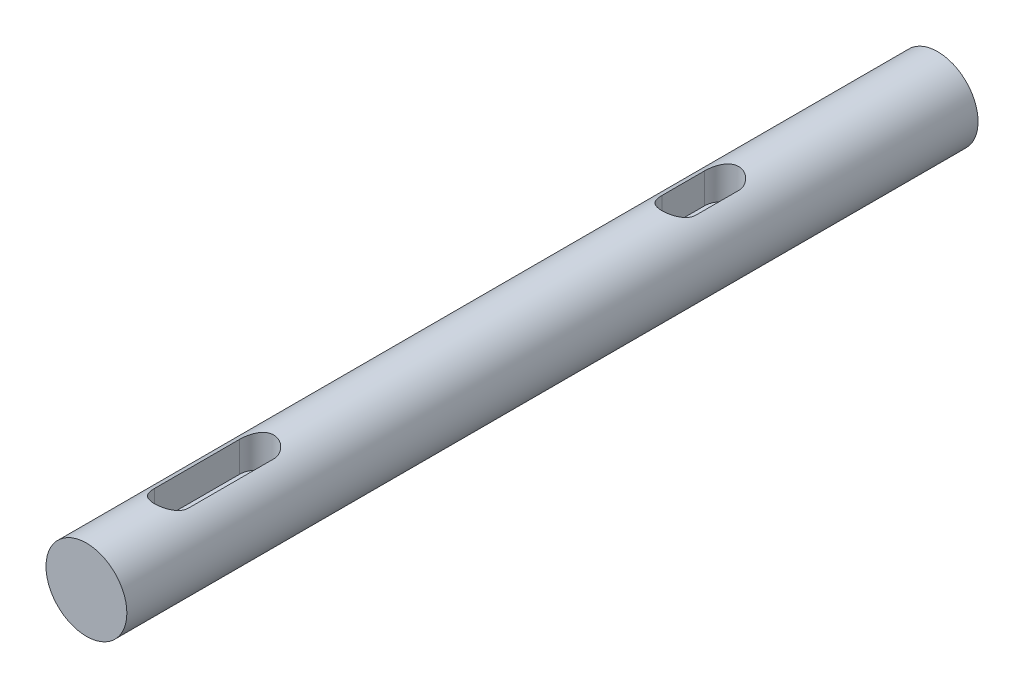
ISO-10303-21;
HEADER;
FILE_DESCRIPTION(('STEP AP214'),'2;1');
FILE_NAME('part.step','',(''),(''),'','','');
FILE_SCHEMA(('AUTOMOTIVE_DESIGN { 1 0 10303 214 1 1 1 1 }'));
ENDSEC;
DATA;
#1=APPLICATION_CONTEXT('core data for automotive mechanical design processes');
#2=APPLICATION_PROTOCOL_DEFINITION('international standard','automotive_design',2000,#1);
#3=PRODUCT_CONTEXT('',#1,'mechanical');
#4=PRODUCT('Part','Part','',(#3));
#5=PRODUCT_RELATED_PRODUCT_CATEGORY('part','',(#4));
#6=PRODUCT_DEFINITION_FORMATION('','',#4);
#7=PRODUCT_DEFINITION_CONTEXT('part definition',#1,'design');
#8=PRODUCT_DEFINITION('design','',#6,#7);
#9=PRODUCT_DEFINITION_SHAPE('','',#8);
#10=(LENGTH_UNIT() NAMED_UNIT(*) SI_UNIT(.MILLI.,.METRE.));
#11=(NAMED_UNIT(*) PLANE_ANGLE_UNIT() SI_UNIT($,.RADIAN.));
#12=(NAMED_UNIT(*) SI_UNIT($,.STERADIAN.) SOLID_ANGLE_UNIT());
#13=UNCERTAINTY_MEASURE_WITH_UNIT(LENGTH_MEASURE(1.E-05),#10,'distance_accuracy_value','');
#14=(GEOMETRIC_REPRESENTATION_CONTEXT(3) GLOBAL_UNCERTAINTY_ASSIGNED_CONTEXT((#13)) GLOBAL_UNIT_ASSIGNED_CONTEXT((#10,
#11,#12)) REPRESENTATION_CONTEXT('',''));
#15=CARTESIAN_POINT('',(0.,0.,0.));
#16=DIRECTION('',(0.,0.,1.));
#17=DIRECTION('',(1.,0.,0.));
#18=AXIS2_PLACEMENT_3D('',#15,#16,#17);
#19=CARTESIAN_POINT('',(0.,0.,0.0001));
#20=DIRECTION('',(0.,0.,-1.));
#21=DIRECTION('',(-1.,0.,0.));
#22=AXIS2_PLACEMENT_3D('',#19,#20,#21);
#23=CYLINDRICAL_SURFACE('',#22,4.75);
#24=CARTESIAN_POINT('',(0.,0.,0.0001));
#25=DIRECTION('',(0.,0.,1.));
#26=DIRECTION('',(1.,0.,0.));
#27=AXIS2_PLACEMENT_3D('',#24,#25,#26);
#28=CIRCLE('',#27,4.75);
#29=CARTESIAN_POINT('',(4.75,0.,0.0001));
#30=VERTEX_POINT('',#29);
#31=EDGE_CURVE('E130',#30,#30,#28,.T.);
#32=ORIENTED_EDGE('',*,*,#31,.F.);
#33=EDGE_LOOP('',(#32));
#34=FACE_BOUND('',#33,.T.);
#35=CARTESIAN_POINT('',(0.,4.75,-67.62));
#36=CARTESIAN_POINT('',(-0.107036462368458,4.74999105230106,-67.62001185467));
#37=CARTESIAN_POINT('',(-0.214236246167389,4.7463402994097,-67.6286434104685));
#38=CARTESIAN_POINT('',(-0.4255931318699,4.73208882609393,-67.6628608489265));
#39=CARTESIAN_POINT('',(-0.52974166164922,4.7214701827862,-67.6884904559829));
#40=CARTESIAN_POINT('',(-0.731590406184848,4.69442284735135,-67.7555852054463));
#41=CARTESIAN_POINT('',(-0.829311330167864,4.67801402078023,-67.7969962416775));
#42=CARTESIAN_POINT('',(-1.0163228467502,4.64097919078582,-67.8942526428769));
#43=CARTESIAN_POINT('',(-1.10561588355066,4.62035441557184,-67.9500938052442));
#44=CARTESIAN_POINT('',(-1.27793883653739,4.57576887526126,-68.0776343007205));
#45=CARTESIAN_POINT('',(-1.36048223127561,4.55169736788395,-68.1499519132003));
#46=CARTESIAN_POINT('',(-1.51268912853782,4.50340541179333,-68.30708449633));
#47=CARTESIAN_POINT('',(-1.58234571599153,4.47918489027961,-68.3919061330397));
#48=CARTESIAN_POINT('',(-1.71027969557345,4.43196710928289,-68.576828163732));
#49=CARTESIAN_POINT('',(-1.76780496391063,4.40909335958272,-68.6774837575963));
#50=CARTESIAN_POINT('',(-1.86489069620241,4.36892020968375,-68.8881440439665));
#51=CARTESIAN_POINT('',(-1.90446060785822,4.35161787932547,-68.9981437835356));
#52=CARTESIAN_POINT('',(-1.9624924807831,4.32574780180008,-69.2187692649238));
#53=CARTESIAN_POINT('',(-1.98189190257055,4.31679434717452,-69.3291014276598));
#54=CARTESIAN_POINT('',(-2.00195562895775,4.30752932662971,-69.5517901438235));
#55=CARTESIAN_POINT('',(-2.00263058226539,4.30721284881607,-69.6641455102597));
#56=CARTESIAN_POINT('',(-1.98593120072108,4.31493181644961,-69.8782608732941));
#57=CARTESIAN_POINT('',(-1.96997131078922,4.32231278335099,-69.9801595623539));
#58=CARTESIAN_POINT('',(-1.92283162811083,4.34348696653289,-70.1796693785866));
#59=CARTESIAN_POINT('',(-1.89164884741754,4.35728144163054,-70.2772796599302));
#60=CARTESIAN_POINT('',(-1.81433790634179,4.39004171904363,-70.4679336847939));
#61=CARTESIAN_POINT('',(-1.76790298398402,4.40911227810592,-70.5608342236556));
#62=CARTESIAN_POINT('',(-1.66162325591989,4.45025281005121,-70.7378910559781));
#63=CARTESIAN_POINT('',(-1.60177309979157,4.47232397828682,-70.8220438409003));
#64=CARTESIAN_POINT('',(-1.46428805277279,4.51930009875197,-70.9868756876891));
#65=CARTESIAN_POINT('',(-1.38556278942613,4.54428505688557,-71.0666250891941));
#66=CARTESIAN_POINT('',(-1.21561328405726,4.59266646060081,-71.2121054081883));
#67=CARTESIAN_POINT('',(-1.12438599890453,4.61606251734623,-71.2778329026005));
#68=CARTESIAN_POINT('',(-0.92914594821936,4.65933566537717,-71.3948065200699));
#69=CARTESIAN_POINT('',(-0.824878687890054,4.67911472030857,-71.4456668320559));
#70=CARTESIAN_POINT('',(-0.60822226241133,4.7121696275971,-71.5287972107732));
#71=CARTESIAN_POINT('',(-0.495837723966105,4.72544915152312,-71.5610777749758));
#72=CARTESIAN_POINT('',(-0.273899430083205,4.7433183819797,-71.6041687998687));
#73=CARTESIAN_POINT('',(-0.164628362907152,4.74841197266554,-71.6162264062904));
#74=CARTESIAN_POINT('',(0.0544859422097707,4.7509495140171,-71.6222568877003));
#75=CARTESIAN_POINT('',(0.164329001896021,4.74839572034202,-71.6162350953553));
#76=CARTESIAN_POINT('',(0.375578198064437,4.73625128095379,-71.5871637151306));
#77=CARTESIAN_POINT('',(0.477129162603383,4.72702550402368,-71.5649966286002));
#78=CARTESIAN_POINT('',(0.674955484098691,4.70285789767311,-71.5054995491865));
#79=CARTESIAN_POINT('',(0.771230176352191,4.68791534993975,-71.4681676508063));
#80=CARTESIAN_POINT('',(0.959158229909813,4.65316408364171,-71.3781831910779));
#81=CARTESIAN_POINT('',(1.05057430517146,4.633218314788,-71.3250897202064));
#82=CARTESIAN_POINT('',(1.22352777344185,4.59058023824968,-71.2055727882067));
#83=CARTESIAN_POINT('',(1.30506098197807,4.56788677524527,-71.1391437120931));
#84=CARTESIAN_POINT('',(1.46218525430955,4.52014832220439,-70.9891786849424));
#85=CARTESIAN_POINT('',(1.53690971771378,4.49505251450344,-70.9047486253149));
#86=CARTESIAN_POINT('',(1.67137911518236,4.44680874465642,-70.7241596537414));
#87=CARTESIAN_POINT('',(1.73112037565901,4.42366126112372,-70.6279978739811));
#88=CARTESIAN_POINT('',(1.83465029067007,4.38175075287145,-70.4245369191052));
#89=CARTESIAN_POINT('',(1.87817619877721,4.3630615717636,-70.3170877008913));
#90=CARTESIAN_POINT('',(1.94613970779112,4.33317944385815,-70.0953490302796));
#91=CARTESIAN_POINT('',(1.97059349891389,4.32198014009814,-69.981065468458));
#92=CARTESIAN_POINT('',(1.99809365532078,4.30933055153168,-69.7585390720137));
#93=CARTESIAN_POINT('',(2.00266563478006,4.30718588214918,-69.6505234608846));
#94=CARTESIAN_POINT('',(1.99436289136938,4.31103684419065,-69.4353241375309));
#95=CARTESIAN_POINT('',(1.98149098638983,4.31703116084065,-69.3281402937551));
#96=CARTESIAN_POINT('',(1.93995635081154,4.33584430782861,-69.1230146088952));
#97=CARTESIAN_POINT('',(1.91209039204409,4.34831777145251,-69.024876697324));
#98=CARTESIAN_POINT('',(1.84214689268935,4.37840569203651,-68.8346514943026));
#99=CARTESIAN_POINT('',(1.80006534139776,4.39602159966499,-68.7425659191917));
#100=CARTESIAN_POINT('',(1.69994007024286,4.43573763071445,-68.5609424558704));
#101=CARTESIAN_POINT('',(1.64108110570075,4.45804534068644,-68.4719002611461));
#102=CARTESIAN_POINT('',(1.51020038304187,4.5040651794814,-68.30447943852));
#103=CARTESIAN_POINT('',(1.43817390715274,4.52777780960673,-68.2261046502453));
#104=CARTESIAN_POINT('',(1.27659022248805,4.57607254723289,-68.0761890161143));
#105=CARTESIAN_POINT('',(1.18612311549112,4.60058638516999,-68.0056022437799));
#106=CARTESIAN_POINT('',(0.993725379452203,4.64594055900097,-67.88055510456));
#107=CARTESIAN_POINT('',(0.891789570387905,4.66677922394583,-67.8261020654037));
#108=CARTESIAN_POINT('',(0.680840837781724,4.70215008458216,-67.7360131139672));
#109=CARTESIAN_POINT('',(0.571965756964759,4.71677703656465,-67.7000925274494));
#110=CARTESIAN_POINT('',(0.349166725075995,4.73846042696525,-67.6474127247087));
#111=CARTESIAN_POINT('',(0.235259686811361,4.74554047417122,-67.6305937425567));
#112=CARTESIAN_POINT('',(0.0806138559737841,4.74949001252044,-67.6212141009984));
#113=CARTESIAN_POINT('',(0.0403185146594561,4.75000337042091,-67.6199955345807));
#114=CARTESIAN_POINT('',(0.,4.75,-67.62));
#115=B_SPLINE_CURVE_WITH_KNOTS('',3,(#35,#36,#37,#38,#39,#40,#41,#42,#43,#44,#45,#46,#47,#48,
#49,#50,#51,#52,#53,#54,#55,#56,#57,#58,#59,#60,#61,#62,#63,#64,#65,#66,#67,#68,#69,#70,#71,#72,
#73,#74,#75,#76,#77,#78,#79,#80,#81,#82,#83,#84,#85,#86,#87,#88,#89,#90,#91,#92,#93,#94,#95,#96,
#97,#98,#99,#100,#101,#102,#103,#104,#105,#106,#107,#108,#109,#110,#111,#112,#113,#114),
.UNSPECIFIED.,.T.,.F.,(4,2,2,2,2,2,2,2,2,2,2,2,2,2,2,2,2,2,2,2,2,2,2,2,2,2,2,2,2,2,2,2,2,2,2,2,
2,2,2,4),(0.,0.320992833427257,0.64281458176342,0.963542757751966,1.28417763057549,
1.61977067727505,1.95554328441993,2.30826935782324,2.66080961894182,2.99611267136668,
3.33122503119563,3.63999866694788,3.94883293312583,4.26430374352241,4.57990059829873,
4.92278837411683,5.26575976135261,5.61697022291761,5.96798205692134,6.2964221731948,
6.62476542288596,6.93639255342285,7.24805885281147,7.56943103565565,7.8909388178337,
8.23588662956776,8.58091893324741,8.93132109614982,9.28142547982677,9.60412990992076,
9.92678221645594,10.2337737894146,10.5408520476219,10.8666093059307,11.1924835089913,
11.5428100141678,11.8932953899746,12.2382234684013,12.5820693217041,12.7029809622212),.UNSPECIFIED.);
#116=CARTESIAN_POINT('',(2.,4.30842198490352,-69.62));
#117=VERTEX_POINT('',#116);
#118=CARTESIAN_POINT('',(-2.,4.30842198490353,-69.62));
#119=VERTEX_POINT('',#118);
#120=EDGE_CURVE('E162',#117,#119,#115,.T.);
#121=ORIENTED_EDGE('',*,*,#120,.T.);
#122=DIRECTION('',(0.,0.,-1.));
#123=VECTOR('',#122,1.);
#124=CARTESIAN_POINT('',(-1.99999999999999,4.30842198490353,0.000100000000000347));
#125=LINE('',#124,#123);
#126=CARTESIAN_POINT('',(-2.,4.30842198490352,-74.62));
#127=VERTEX_POINT('',#126);
#128=EDGE_CURVE('E226',#119,#127,#125,.T.);
#129=ORIENTED_EDGE('',*,*,#128,.T.);
#130=CARTESIAN_POINT('',(-2.,4.30842198490352,-74.62));
#131=CARTESIAN_POINT('',(-2.00000825897847,4.30841011380863,-74.6735345521795));
#132=CARTESIAN_POINT('',(-1.99785077580663,4.30941948868661,-74.7270626203057));
#133=CARTESIAN_POINT('',(-1.98926895598115,4.31339190043555,-74.8336806605893));
#134=CARTESIAN_POINT('',(-1.98284642205527,4.31635411188867,-74.8867708082498));
#135=CARTESIAN_POINT('',(-1.96583546331159,4.32412685921061,-74.9919086170322));
#136=CARTESIAN_POINT('',(-1.95526496151924,4.32892944092505,-75.0439597640355));
#137=CARTESIAN_POINT('',(-1.93008063678102,4.34021639850274,-75.146876490161));
#138=CARTESIAN_POINT('',(-1.91546652876178,4.34670089293847,-75.1977419854209));
#139=CARTESIAN_POINT('',(-1.86580159284002,4.36836357128853,-75.3479210577477));
#140=CARTESIAN_POINT('',(-1.82489049441326,4.38576927521462,-75.4450461623364));
#141=CARTESIAN_POINT('',(-1.72877761751093,4.42453395003012,-75.6311028015001));
#142=CARTESIAN_POINT('',(-1.67356058478861,4.44589713376059,-75.7200254518071));
#143=CARTESIAN_POINT('',(-1.5466970330628,4.49166147940215,-75.8927314297968));
#144=CARTESIAN_POINT('',(-1.47429275333465,4.51616643744312,-75.975931880412));
#145=CARTESIAN_POINT('',(-1.31671324923855,4.56459815123147,-76.1294276951559));
#146=CARTESIAN_POINT('',(-1.23153526514574,4.58852478073221,-76.1997202632527));
#147=CARTESIAN_POINT('',(-1.04615818529678,4.63438845471728,-76.3284609802936));
#148=CARTESIAN_POINT('',(-0.945458954563393,4.65618937738374,-76.3862419568379));
#149=CARTESIAN_POINT('',(-0.73468604546084,4.69405729356391,-76.4837873533973));
#150=CARTESIAN_POINT('',(-0.624616680062096,4.71012690764841,-76.5235600097447));
#151=CARTESIAN_POINT('',(-0.404416494415522,4.73397850916716,-76.5818156799075));
#152=CARTESIAN_POINT('',(-0.294598268754064,4.74215468693835,-76.6013155455394));
#153=CARTESIAN_POINT('',(-0.0729626666572592,4.75073206966691,-76.621761025194));
#154=CARTESIAN_POINT('',(0.0388538989780651,4.75113635936248,-76.6227140006602));
#155=CARTESIAN_POINT('',(0.253905429928733,4.74435398903119,-76.6065639230233));
#156=CARTESIAN_POINT('',(0.357241980790302,4.73763734019635,-76.5905788841423));
#157=CARTESIAN_POINT('',(0.559604839076467,4.71801662503928,-76.5429274930626));
#158=CARTESIAN_POINT('',(0.658630904250336,4.70511221145107,-76.5112602607541));
#159=CARTESIAN_POINT('',(0.851386562974539,4.67411215558031,-76.4327713127215));
#160=CARTESIAN_POINT('',(0.945012060118188,4.65594017778792,-76.3857253519174));
#161=CARTESIAN_POINT('',(1.12328635555474,4.61617617583575,-76.2780359818031));
#162=CARTESIAN_POINT('',(1.20793184001568,4.59458289641562,-76.2173875784103));
#163=CARTESIAN_POINT('',(1.37229261321634,4.54830925830985,-76.0791622640776));
#164=CARTESIAN_POINT('',(1.45121931903452,4.52351856467951,-76.0006833973799));
#165=CARTESIAN_POINT('',(1.59514685474077,4.47479534120691,-75.831545978794));
#166=CARTESIAN_POINT('',(1.66014041317758,4.45086326485933,-75.7408811072161));
#167=CARTESIAN_POINT('',(1.77646069116463,4.40576013472035,-75.5460160087572));
#168=CARTESIAN_POINT('',(1.82723508960303,4.38471366190087,-75.4414553439709));
#169=CARTESIAN_POINT('',(1.91007593515836,4.3492720372682,-75.2242046745369));
#170=CARTESIAN_POINT('',(1.94217723884358,4.33486450324614,-75.1115302605157));
#171=CARTESIAN_POINT('',(1.97608704818706,4.31946072439427,-74.9347505888374));
#172=CARTESIAN_POINT('',(1.98503842328058,4.31534376229517,-74.8722078904901));
#173=CARTESIAN_POINT('',(1.99699778436201,4.30981639016708,-74.7464577129161));
#174=CARTESIAN_POINT('',(2.00000744288469,4.30840521848792,-74.6832504258025));
#175=CARTESIAN_POINT('',(2.,4.30842198490352,-74.62));
#176=B_SPLINE_CURVE_WITH_KNOTS('',3,(#130,#131,#132,#133,#134,#135,#136,#137,#138,#139,#140,
#141,#142,#143,#144,#145,#146,#147,#148,#149,#150,#151,#152,#153,#154,#155,#156,#157,#158,#159,
#160,#161,#162,#163,#164,#165,#166,#167,#168,#169,#170,#171,#172,#173,#174,#175),.UNSPECIFIED.,
.F.,.F.,(4,2,2,2,2,2,2,2,2,2,2,2,2,2,2,2,2,2,2,2,2,2,4),(0.,0.16053992411034,0.321012035258062,
0.480798262488674,0.640595757485584,0.959501305052973,1.27874830739584,1.61621382147967,
1.95375234940694,2.30632810114733,2.65874243463348,2.99247422288711,3.32607354700202,
3.63894872966083,3.95184147336606,4.26951694268118,4.58730923676543,4.9278860236913,
5.2686401209508,5.62121508050697,5.97312976810162,6.1627656022724,6.35234804820541),.UNSPECIFIED.);
#177=CARTESIAN_POINT('',(2.,4.30842198490352,-74.62));
#178=VERTEX_POINT('',#177);
#179=EDGE_CURVE('E155',#127,#178,#176,.T.);
#180=ORIENTED_EDGE('',*,*,#179,.T.);
#181=DIRECTION('',(0.,0.,-1.));
#182=VECTOR('',#181,1.);
#183=CARTESIAN_POINT('',(2.00000000000001,4.30842198490352,9.99999999996531E-05));
#184=LINE('',#183,#182);
#185=EDGE_CURVE('E238',#178,#117,#184,.F.);
#186=ORIENTED_EDGE('',*,*,#185,.T.);
#187=EDGE_LOOP('',(#121,#129,#180,#186));
#188=FACE_BOUND('',#187,.T.);
#189=CARTESIAN_POINT('',(0.,4.75,-8.));
#190=CARTESIAN_POINT('',(-0.107036462368458,4.74999105230106,-8.00001185467003));
#191=CARTESIAN_POINT('',(-0.21423624616739,4.7463402994097,-8.00864341046847));
#192=CARTESIAN_POINT('',(-0.425593131869901,4.73208882609393,-8.04286084892646));
#193=CARTESIAN_POINT('',(-0.52974166164922,4.7214701827862,-8.06849045598295));
#194=CARTESIAN_POINT('',(-0.731590406184852,4.69442284735135,-8.13558520544629));
#195=CARTESIAN_POINT('',(-0.829311330167874,4.67801402078023,-8.17699624167746));
#196=CARTESIAN_POINT('',(-1.01632284675021,4.64097919078582,-8.27425264287692));
#197=CARTESIAN_POINT('',(-1.10561588355067,4.62035441557184,-8.33009380524416));
#198=CARTESIAN_POINT('',(-1.27793883653739,4.57576887526126,-8.45763430072049));
#199=CARTESIAN_POINT('',(-1.36048223127562,4.55169736788395,-8.5299519132003));
#200=CARTESIAN_POINT('',(-1.51268912853782,4.50340541179333,-8.68708449633));
#201=CARTESIAN_POINT('',(-1.58234571599153,4.4791848902796,-8.77190613303968));
#202=CARTESIAN_POINT('',(-1.71027969557346,4.43196710928289,-8.95682816373201));
#203=CARTESIAN_POINT('',(-1.76780496391063,4.40909335958272,-9.05748375759631));
#204=CARTESIAN_POINT('',(-1.86489069620241,4.36892020968375,-9.26814404396651));
#205=CARTESIAN_POINT('',(-1.90446060785823,4.35161787932547,-9.37814378353564));
#206=CARTESIAN_POINT('',(-1.9624924807831,4.32574780180008,-9.59876926492375));
#207=CARTESIAN_POINT('',(-1.98189190257055,4.31679434717452,-9.70910142765978));
#208=CARTESIAN_POINT('',(-2.00195562895774,4.30752932662971,-9.93179014382348));
#209=CARTESIAN_POINT('',(-2.00263058226538,4.30721284881607,-10.0441455102597));
#210=CARTESIAN_POINT('',(-1.98593120072107,4.31493181644961,-10.2582608732941));
#211=CARTESIAN_POINT('',(-1.96997131078922,4.32231278335099,-10.3601595623539));
#212=CARTESIAN_POINT('',(-1.92283162811082,4.34348696653289,-10.5596693785866));
#213=CARTESIAN_POINT('',(-1.89164884741754,4.35728144163054,-10.6572796599302));
#214=CARTESIAN_POINT('',(-1.81433790634178,4.39004171904363,-10.847933684794));
#215=CARTESIAN_POINT('',(-1.76790298398402,4.40911227810592,-10.9408342236556));
#216=CARTESIAN_POINT('',(-1.66162325591989,4.45025281005121,-11.1178910559781));
#217=CARTESIAN_POINT('',(-1.60177309979156,4.47232397828682,-11.2020438409003));
#218=CARTESIAN_POINT('',(-1.46428805277278,4.51930009875198,-11.3668756876891));
#219=CARTESIAN_POINT('',(-1.38556278942612,4.54428505688558,-11.4466250891941));
#220=CARTESIAN_POINT('',(-1.21561328405725,4.59266646060081,-11.5921054081883));
#221=CARTESIAN_POINT('',(-1.12438599890452,4.61606251734623,-11.6578329026005));
#222=CARTESIAN_POINT('',(-0.929145948219352,4.65933566537717,-11.7748065200699));
#223=CARTESIAN_POINT('',(-0.824878687890045,4.67911472030857,-11.8256668320559));
#224=CARTESIAN_POINT('',(-0.608222262411321,4.7121696275971,-11.9087972107732));
#225=CARTESIAN_POINT('',(-0.495837723966098,4.72544915152312,-11.9410777749758));
#226=CARTESIAN_POINT('',(-0.2738994300832,4.7433183819797,-11.9841687998686));
#227=CARTESIAN_POINT('',(-0.164628362907147,4.74841197266554,-11.9962264062903));
#228=CARTESIAN_POINT('',(0.0544859422097773,4.7509495140171,-12.0022568877003));
#229=CARTESIAN_POINT('',(0.164329001896028,4.74839572034202,-11.9962350953553));
#230=CARTESIAN_POINT('',(0.375578198064443,4.73625128095379,-11.9671637151306));
#231=CARTESIAN_POINT('',(0.477129162603388,4.72702550402368,-11.9449966286003));
#232=CARTESIAN_POINT('',(0.674955484098695,4.70285789767311,-11.8854995491865));
#233=CARTESIAN_POINT('',(0.771230176352195,4.68791534993975,-11.8481676508063));
#234=CARTESIAN_POINT('',(0.959158229909817,4.65316408364171,-11.7581831910779));
#235=CARTESIAN_POINT('',(1.05057430517146,4.63321831478799,-11.7050897202064));
#236=CARTESIAN_POINT('',(1.22352777344185,4.59058023824968,-11.5855727882067));
#237=CARTESIAN_POINT('',(1.30506098197807,4.56788677524527,-11.5191437120931));
#238=CARTESIAN_POINT('',(1.46218525430955,4.52014832220439,-11.3691786849424));
#239=CARTESIAN_POINT('',(1.53690971771379,4.49505251450344,-11.2847486253149));
#240=CARTESIAN_POINT('',(1.67137911518237,4.44680874465642,-11.1041596537413));
#241=CARTESIAN_POINT('',(1.73112037565902,4.42366126112371,-11.0079978739811));
#242=CARTESIAN_POINT('',(1.83465029067007,4.38175075287145,-10.8045369191052));
#243=CARTESIAN_POINT('',(1.87817619877721,4.3630615717636,-10.6970877008913));
#244=CARTESIAN_POINT('',(1.94613970779112,4.33317944385815,-10.4753490302796));
#245=CARTESIAN_POINT('',(1.9705934989139,4.32198014009814,-10.361065468458));
#246=CARTESIAN_POINT('',(1.99809365532078,4.30933055153168,-10.1385390720137));
#247=CARTESIAN_POINT('',(2.00266563478006,4.30718588214918,-10.0305234608846));
#248=CARTESIAN_POINT('',(1.99436289136938,4.31103684419065,-9.81532413753089));
#249=CARTESIAN_POINT('',(1.98149098638983,4.31703116084065,-9.70814029375512));
#250=CARTESIAN_POINT('',(1.93995635081153,4.33584430782861,-9.50301460889519));
#251=CARTESIAN_POINT('',(1.91209039204409,4.34831777145251,-9.40487669732396));
#252=CARTESIAN_POINT('',(1.84214689268935,4.37840569203651,-9.21465149430263));
#253=CARTESIAN_POINT('',(1.80006534139776,4.39602159966499,-9.12256591919172));
#254=CARTESIAN_POINT('',(1.69994007024285,4.43573763071445,-8.94094245587041));
#255=CARTESIAN_POINT('',(1.64108110570075,4.45804534068644,-8.85190026114613));
#256=CARTESIAN_POINT('',(1.51020038304186,4.5040651794814,-8.68447943852002));
#257=CARTESIAN_POINT('',(1.43817390715273,4.52777780960673,-8.60610465024526));
#258=CARTESIAN_POINT('',(1.27659022248804,4.57607254723289,-8.4561890161143));
#259=CARTESIAN_POINT('',(1.18612311549111,4.60058638516999,-8.38560224377989));
#260=CARTESIAN_POINT('',(0.993725379452199,4.64594055900097,-8.26055510456004));
#261=CARTESIAN_POINT('',(0.891789570387903,4.66677922394583,-8.20610206540375));
#262=CARTESIAN_POINT('',(0.680840837781725,4.70215008458216,-8.11601311396725));
#263=CARTESIAN_POINT('',(0.571965756964757,4.71677703656465,-8.08009252744934));
#264=CARTESIAN_POINT('',(0.349166725075991,4.73846042696525,-8.02741272470871));
#265=CARTESIAN_POINT('',(0.235259686811356,4.74554047417122,-8.01059374255665));
#266=CARTESIAN_POINT('',(0.08061385597378,4.74949001252044,-8.00121410099845));
#267=CARTESIAN_POINT('',(0.0403185146594541,4.75000337042091,-7.99999553458068));
#268=CARTESIAN_POINT('',(0.,4.75,-8.));
#269=B_SPLINE_CURVE_WITH_KNOTS('',3,(#189,#190,#191,#192,#193,#194,#195,#196,#197,#198,#199,
#200,#201,#202,#203,#204,#205,#206,#207,#208,#209,#210,#211,#212,#213,#214,#215,#216,#217,#218,
#219,#220,#221,#222,#223,#224,#225,#226,#227,#228,#229,#230,#231,#232,#233,#234,#235,#236,#237,
#238,#239,#240,#241,#242,#243,#244,#245,#246,#247,#248,#249,#250,#251,#252,#253,#254,#255,#256,
#257,#258,#259,#260,#261,#262,#263,#264,#265,#266,#267,#268),.UNSPECIFIED.,.T.,.F.,(4,2,2,2,2,2,
2,2,2,2,2,2,2,2,2,2,2,2,2,2,2,2,2,2,2,2,2,2,2,2,2,2,2,2,2,2,2,2,2,4),(0.,0.320992833427258,
0.642814581763423,0.963542757751975,1.2841776305755,1.61977067727506,1.95554328441993,
2.30826935782324,2.66080961894182,2.99611267136669,3.33122503119565,3.63999866694788,
3.94883293312584,4.26430374352242,4.57990059829875,4.92278837411684,5.26575976135261,
5.61697022291763,5.96798205692134,6.29642217319481,6.62476542288596,6.93639255342285,
7.24805885281148,7.56943103565565,7.89093881783371,8.23588662956778,8.58091893324743,
8.93132109614982,9.28142547982678,9.60412990992076,9.92678221645596,10.2337737894146,
10.5408520476219,10.8666093059307,11.1924835089913,11.5428100141678,11.8932953899746,
12.2382234684013,12.5820693217041,12.7029809622212),.UNSPECIFIED.);
#270=CARTESIAN_POINT('',(2.,4.30842198490352,-10.));
#271=VERTEX_POINT('',#270);
#272=CARTESIAN_POINT('',(-2.,4.30842198490352,-10.));
#273=VERTEX_POINT('',#272);
#274=EDGE_CURVE('E102',#271,#273,#269,.T.);
#275=ORIENTED_EDGE('',*,*,#274,.T.);
#276=DIRECTION('',(0.,0.,-1.));
#277=VECTOR('',#276,1.);
#278=CARTESIAN_POINT('',(-2.,4.30842198490352,0.0001));
#279=LINE('',#278,#277);
#280=CARTESIAN_POINT('',(-2.,4.30842198490352,-20.));
#281=VERTEX_POINT('',#280);
#282=EDGE_CURVE('E11',#273,#281,#279,.T.);
#283=ORIENTED_EDGE('',*,*,#282,.T.);
#284=CARTESIAN_POINT('',(-2.,4.30842198490352,-20.));
#285=CARTESIAN_POINT('',(-2.00000825897847,4.30841011380863,-20.0535345521795));
#286=CARTESIAN_POINT('',(-1.99785077580663,4.30941948868661,-20.1070626203057));
#287=CARTESIAN_POINT('',(-1.98926895598115,4.31339190043556,-20.2136806605892));
#288=CARTESIAN_POINT('',(-1.98284642205527,4.31635411188867,-20.2667708082498));
#289=CARTESIAN_POINT('',(-1.96583546331159,4.32412685921061,-20.3719086170322));
#290=CARTESIAN_POINT('',(-1.95526496151924,4.32892944092505,-20.4239597640355));
#291=CARTESIAN_POINT('',(-1.93008063678102,4.34021639850275,-20.526876490161));
#292=CARTESIAN_POINT('',(-1.91546652876178,4.34670089293847,-20.5777419854209));
#293=CARTESIAN_POINT('',(-1.86580159284002,4.36836357128854,-20.7279210577477));
#294=CARTESIAN_POINT('',(-1.82489049441326,4.38576927521462,-20.8250461623364));
#295=CARTESIAN_POINT('',(-1.72877761751093,4.42453395003012,-21.0111028015002));
#296=CARTESIAN_POINT('',(-1.67356058478861,4.44589713376059,-21.1000254518071));
#297=CARTESIAN_POINT('',(-1.5466970330628,4.49166147940215,-21.2727314297968));
#298=CARTESIAN_POINT('',(-1.47429275333466,4.51616643744312,-21.355931880412));
#299=CARTESIAN_POINT('',(-1.31671324923856,4.56459815123146,-21.5094276951558));
#300=CARTESIAN_POINT('',(-1.23153526514576,4.58852478073221,-21.5797202632527));
#301=CARTESIAN_POINT('',(-1.04615818529679,4.63438845471727,-21.7084609802936));
#302=CARTESIAN_POINT('',(-0.945458954563403,4.65618937738373,-21.7662419568379));
#303=CARTESIAN_POINT('',(-0.734686045460846,4.69405729356391,-21.8637873533973));
#304=CARTESIAN_POINT('',(-0.6246166800621,4.71012690764841,-21.9035600097447));
#305=CARTESIAN_POINT('',(-0.404416494415526,4.73397850916716,-21.9618156799075));
#306=CARTESIAN_POINT('',(-0.294598268754068,4.74215468693835,-21.9813155455394));
#307=CARTESIAN_POINT('',(-0.0729626666572622,4.75073206966691,-22.001761025194));
#308=CARTESIAN_POINT('',(0.0388538989780631,4.75113635936249,-22.0027140006602));
#309=CARTESIAN_POINT('',(0.253905429928732,4.74435398903119,-21.9865639230233));
#310=CARTESIAN_POINT('',(0.3572419807903,4.73763734019635,-21.9705788841423));
#311=CARTESIAN_POINT('',(0.559604839076465,4.71801662503928,-21.9229274930626));
#312=CARTESIAN_POINT('',(0.658630904250334,4.70511221145107,-21.8912602607541));
#313=CARTESIAN_POINT('',(0.851386562974538,4.67411215558031,-21.8127713127215));
#314=CARTESIAN_POINT('',(0.945012060118189,4.65594017778792,-21.7657253519174));
#315=CARTESIAN_POINT('',(1.12328635555474,4.61617617583575,-21.6580359818032));
#316=CARTESIAN_POINT('',(1.20793184001568,4.59458289641562,-21.5973875784103));
#317=CARTESIAN_POINT('',(1.37229261321633,4.54830925830985,-21.4591622640776));
#318=CARTESIAN_POINT('',(1.45121931903451,4.52351856467951,-21.3806833973799));
#319=CARTESIAN_POINT('',(1.59514685474077,4.47479534120691,-21.211545978794));
#320=CARTESIAN_POINT('',(1.66014041317758,4.45086326485933,-21.1208811072161));
#321=CARTESIAN_POINT('',(1.77646069116463,4.40576013472035,-20.9260160087572));
#322=CARTESIAN_POINT('',(1.82723508960302,4.38471366190087,-20.8214553439709));
#323=CARTESIAN_POINT('',(1.91007593515836,4.3492720372682,-20.6042046745369));
#324=CARTESIAN_POINT('',(1.94217723884358,4.33486450324615,-20.4915302605157));
#325=CARTESIAN_POINT('',(1.97608704818706,4.31946072439427,-20.3147505888374));
#326=CARTESIAN_POINT('',(1.98503842328058,4.31534376229517,-20.2522078904901));
#327=CARTESIAN_POINT('',(1.99699778436201,4.30981639016708,-20.1264577129161));
#328=CARTESIAN_POINT('',(2.00000744288469,4.30840521848792,-20.0632504258025));
#329=CARTESIAN_POINT('',(2.,4.30842198490352,-20.));
#330=B_SPLINE_CURVE_WITH_KNOTS('',3,(#284,#285,#286,#287,#288,#289,#290,#291,#292,#293,#294,
#295,#296,#297,#298,#299,#300,#301,#302,#303,#304,#305,#306,#307,#308,#309,#310,#311,#312,#313,
#314,#315,#316,#317,#318,#319,#320,#321,#322,#323,#324,#325,#326,#327,#328,#329),.UNSPECIFIED.,
.F.,.F.,(4,2,2,2,2,2,2,2,2,2,2,2,2,2,2,2,2,2,2,2,2,2,4),(0.,0.160539924110347,0.321012035258066,
0.480798262488678,0.640595757485581,0.95950130505298,1.27874830739584,1.61621382147965,
1.95375234940693,2.30632810114733,2.65874243463348,2.99247422288711,3.32607354700202,
3.63894872966083,3.95184147336606,4.26951694268118,4.58730923676543,4.9278860236913,
5.26864012095079,5.62121508050696,5.9731297681016,6.16276560227239,6.3523480482054),.UNSPECIFIED.);
#331=CARTESIAN_POINT('',(2.,4.30842198490352,-20.));
#332=VERTEX_POINT('',#331);
#333=EDGE_CURVE('E219',#281,#332,#330,.T.);
#334=ORIENTED_EDGE('',*,*,#333,.T.);
#335=DIRECTION('',(0.,0.,-1.));
#336=VECTOR('',#335,1.);
#337=CARTESIAN_POINT('',(2.,4.30842198490352,0.0001));
#338=LINE('',#337,#336);
#339=EDGE_CURVE('E41',#332,#271,#338,.F.);
#340=ORIENTED_EDGE('',*,*,#339,.T.);
#341=EDGE_LOOP('',(#275,#283,#334,#340));
#342=FACE_BOUND('',#341,.T.);
#343=CARTESIAN_POINT('',(0.,0.,-100.));
#344=DIRECTION('',(0.,0.,-1.));
#345=DIRECTION('',(-1.,0.,0.));
#346=AXIS2_PLACEMENT_3D('',#343,#344,#345);
#347=CIRCLE('',#346,4.75);
#348=CARTESIAN_POINT('',(-4.75,0.,-100.));
#349=VERTEX_POINT('',#348);
#350=EDGE_CURVE('E124',#349,#349,#347,.T.);
#351=ORIENTED_EDGE('',*,*,#350,.F.);
#352=EDGE_LOOP('',(#351));
#353=FACE_BOUND('',#352,.T.);
#354=ADVANCED_FACE('F33',(#34,#188,#342,#353),#23,.T.);
#355=CARTESIAN_POINT('',(0.,0.,0.0001));
#356=DIRECTION('',(0.,0.,1.));
#357=DIRECTION('',(1.,0.,0.));
#358=AXIS2_PLACEMENT_3D('',#355,#356,#357);
#359=PLANE('',#358);
#360=ORIENTED_EDGE('',*,*,#31,.T.);
#361=EDGE_LOOP('',(#360));
#362=FACE_BOUND('',#361,.T.);
#363=ADVANCED_FACE('F181',(#362),#359,.T.);
#364=CARTESIAN_POINT('',(0.,0.75,-69.62));
#365=DIRECTION('',(0.,1.,0.));
#366=DIRECTION('',(0.,0.,1.));
#367=AXIS2_PLACEMENT_3D('',#364,#365,#366);
#368=CYLINDRICAL_SURFACE('',#367,2.);
#369=ORIENTED_EDGE('',*,*,#120,.F.);
#370=DIRECTION('',(0.,1.,0.));
#371=VECTOR('',#370,1.);
#372=CARTESIAN_POINT('',(2.,0.75,-69.62));
#373=LINE('',#372,#371);
#374=CARTESIAN_POINT('',(2.,0.75,-69.62));
#375=VERTEX_POINT('',#374);
#376=EDGE_CURVE('E56',#375,#117,#373,.T.);
#377=ORIENTED_EDGE('',*,*,#376,.F.);
#378=CARTESIAN_POINT('',(0.,0.75,-69.62));
#379=DIRECTION('',(0.,1.,0.));
#380=DIRECTION('',(0.,0.,1.));
#381=AXIS2_PLACEMENT_3D('',#378,#379,#380);
#382=CIRCLE('',#381,2.);
#383=CARTESIAN_POINT('',(-2.,0.75,-69.62));
#384=VERTEX_POINT('',#383);
#385=EDGE_CURVE('E135',#384,#375,#382,.T.);
#386=ORIENTED_EDGE('',*,*,#385,.F.);
#387=DIRECTION('',(0.,1.,0.));
#388=VECTOR('',#387,1.);
#389=CARTESIAN_POINT('',(-2.,0.75,-69.62));
#390=LINE('',#389,#388);
#391=EDGE_CURVE('E118',#384,#119,#390,.T.);
#392=ORIENTED_EDGE('',*,*,#391,.T.);
#393=EDGE_LOOP('',(#369,#377,#386,#392));
#394=FACE_BOUND('',#393,.T.);
#395=ADVANCED_FACE('F178',(#394),#368,.F.);
#396=CARTESIAN_POINT('',(-2.,0.75,-69.62));
#397=DIRECTION('',(-1.,0.,0.));
#398=DIRECTION('',(0.,0.,1.));
#399=AXIS2_PLACEMENT_3D('',#396,#397,#398);
#400=PLANE('',#399);
#401=ORIENTED_EDGE('',*,*,#391,.F.);
#402=DIRECTION('',(0.,0.,1.));
#403=VECTOR('',#402,1.);
#404=CARTESIAN_POINT('',(-2.,0.75,-69.62));
#405=LINE('',#404,#403);
#406=CARTESIAN_POINT('',(-2.,0.75,-74.62));
#407=VERTEX_POINT('',#406);
#408=EDGE_CURVE('E144',#407,#384,#405,.T.);
#409=ORIENTED_EDGE('',*,*,#408,.F.);
#410=DIRECTION('',(0.,1.,0.));
#411=VECTOR('',#410,1.);
#412=CARTESIAN_POINT('',(-2.,0.75,-74.62));
#413=LINE('',#412,#411);
#414=EDGE_CURVE('E121',#407,#127,#413,.T.);
#415=ORIENTED_EDGE('',*,*,#414,.T.);
#416=ORIENTED_EDGE('',*,*,#128,.F.);
#417=EDGE_LOOP('',(#401,#409,#415,#416));
#418=FACE_BOUND('',#417,.T.);
#419=ADVANCED_FACE('F173',(#418),#400,.F.);
#420=CARTESIAN_POINT('',(0.,0.75,-74.62));
#421=DIRECTION('',(0.,1.,0.));
#422=DIRECTION('',(0.,0.,1.));
#423=AXIS2_PLACEMENT_3D('',#420,#421,#422);
#424=CYLINDRICAL_SURFACE('',#423,2.);
#425=ORIENTED_EDGE('',*,*,#414,.F.);
#426=CARTESIAN_POINT('',(0.,0.75,-74.62));
#427=DIRECTION('',(0.,1.,0.));
#428=DIRECTION('',(0.,0.,1.));
#429=AXIS2_PLACEMENT_3D('',#426,#427,#428);
#430=CIRCLE('',#429,2.);
#431=CARTESIAN_POINT('',(2.,0.75,-74.62));
#432=VERTEX_POINT('',#431);
#433=EDGE_CURVE('E141',#432,#407,#430,.T.);
#434=ORIENTED_EDGE('',*,*,#433,.F.);
#435=DIRECTION('',(0.,1.,0.));
#436=VECTOR('',#435,1.);
#437=CARTESIAN_POINT('',(2.,0.75,-74.62));
#438=LINE('',#437,#436);
#439=EDGE_CURVE('E149',#432,#178,#438,.T.);
#440=ORIENTED_EDGE('',*,*,#439,.T.);
#441=ORIENTED_EDGE('',*,*,#179,.F.);
#442=EDGE_LOOP('',(#425,#434,#440,#441));
#443=FACE_BOUND('',#442,.T.);
#444=ADVANCED_FACE('F167',(#443),#424,.F.);
#445=CARTESIAN_POINT('',(2.,0.75,-69.62));
#446=DIRECTION('',(1.,0.,0.));
#447=DIRECTION('',(0.,0.,-1.));
#448=AXIS2_PLACEMENT_3D('',#445,#446,#447);
#449=PLANE('',#448);
#450=ORIENTED_EDGE('',*,*,#439,.F.);
#451=DIRECTION('',(0.,0.,-1.));
#452=VECTOR('',#451,1.);
#453=CARTESIAN_POINT('',(2.,0.75,-69.62));
#454=LINE('',#453,#452);
#455=EDGE_CURVE('E138',#375,#432,#454,.T.);
#456=ORIENTED_EDGE('',*,*,#455,.F.);
#457=ORIENTED_EDGE('',*,*,#376,.T.);
#458=ORIENTED_EDGE('',*,*,#185,.F.);
#459=EDGE_LOOP('',(#450,#456,#457,#458));
#460=FACE_BOUND('',#459,.T.);
#461=ADVANCED_FACE('F172',(#460),#449,.F.);
#462=CARTESIAN_POINT('',(0.,0.75,-69.62));
#463=DIRECTION('',(0.,1.,0.));
#464=DIRECTION('',(0.,0.,1.));
#465=AXIS2_PLACEMENT_3D('',#462,#463,#464);
#466=PLANE('',#465);
#467=ORIENTED_EDGE('',*,*,#385,.T.);
#468=ORIENTED_EDGE('',*,*,#455,.T.);
#469=ORIENTED_EDGE('',*,*,#433,.T.);
#470=ORIENTED_EDGE('',*,*,#408,.T.);
#471=EDGE_LOOP('',(#467,#468,#469,#470));
#472=FACE_BOUND('',#471,.T.);
#473=ADVANCED_FACE('F177',(#472),#466,.T.);
#474=CARTESIAN_POINT('',(0.,0.75,-10.));
#475=DIRECTION('',(0.,1.,0.));
#476=DIRECTION('',(0.,0.,1.));
#477=AXIS2_PLACEMENT_3D('',#474,#475,#476);
#478=CYLINDRICAL_SURFACE('',#477,2.);
#479=ORIENTED_EDGE('',*,*,#274,.F.);
#480=DIRECTION('',(0.,1.,0.));
#481=VECTOR('',#480,1.);
#482=CARTESIAN_POINT('',(2.,0.75,-10.));
#483=LINE('',#482,#481);
#484=CARTESIAN_POINT('',(2.,0.75,-10.));
#485=VERTEX_POINT('',#484);
#486=EDGE_CURVE('E48',#485,#271,#483,.T.);
#487=ORIENTED_EDGE('',*,*,#486,.F.);
#488=CARTESIAN_POINT('',(0.,0.75,-10.));
#489=DIRECTION('',(0.,1.,0.));
#490=DIRECTION('',(0.,0.,1.));
#491=AXIS2_PLACEMENT_3D('',#488,#489,#490);
#492=CIRCLE('',#491,2.);
#493=CARTESIAN_POINT('',(-2.,0.75,-10.));
#494=VERTEX_POINT('',#493);
#495=EDGE_CURVE('E100',#494,#485,#492,.T.);
#496=ORIENTED_EDGE('',*,*,#495,.F.);
#497=DIRECTION('',(0.,1.,0.));
#498=VECTOR('',#497,1.);
#499=CARTESIAN_POINT('',(-2.,0.75,-10.));
#500=LINE('',#499,#498);
#501=EDGE_CURVE('E128',#494,#273,#500,.T.);
#502=ORIENTED_EDGE('',*,*,#501,.T.);
#503=EDGE_LOOP('',(#479,#487,#496,#502));
#504=FACE_BOUND('',#503,.T.);
#505=ADVANCED_FACE('F97',(#504),#478,.F.);
#506=CARTESIAN_POINT('',(-2.,0.75,-10.));
#507=DIRECTION('',(-1.,0.,0.));
#508=DIRECTION('',(0.,0.,1.));
#509=AXIS2_PLACEMENT_3D('',#506,#507,#508);
#510=PLANE('',#509);
#511=ORIENTED_EDGE('',*,*,#501,.F.);
#512=DIRECTION('',(0.,0.,1.));
#513=VECTOR('',#512,1.);
#514=CARTESIAN_POINT('',(-2.,0.75,-10.));
#515=LINE('',#514,#513);
#516=CARTESIAN_POINT('',(-2.,0.75,-20.));
#517=VERTEX_POINT('',#516);
#518=EDGE_CURVE('E105',#517,#494,#515,.T.);
#519=ORIENTED_EDGE('',*,*,#518,.F.);
#520=DIRECTION('',(0.,1.,0.));
#521=VECTOR('',#520,1.);
#522=CARTESIAN_POINT('',(-2.,0.75,-20.));
#523=LINE('',#522,#521);
#524=EDGE_CURVE('E131',#517,#281,#523,.T.);
#525=ORIENTED_EDGE('',*,*,#524,.T.);
#526=ORIENTED_EDGE('',*,*,#282,.F.);
#527=EDGE_LOOP('',(#511,#519,#525,#526));
#528=FACE_BOUND('',#527,.T.);
#529=ADVANCED_FACE('F208',(#528),#510,.F.);
#530=CARTESIAN_POINT('',(0.,0.75,-20.));
#531=DIRECTION('',(0.,1.,0.));
#532=DIRECTION('',(0.,0.,1.));
#533=AXIS2_PLACEMENT_3D('',#530,#531,#532);
#534=CYLINDRICAL_SURFACE('',#533,2.);
#535=ORIENTED_EDGE('',*,*,#524,.F.);
#536=CARTESIAN_POINT('',(0.,0.75,-20.));
#537=DIRECTION('',(0.,1.,0.));
#538=DIRECTION('',(0.,0.,1.));
#539=AXIS2_PLACEMENT_3D('',#536,#537,#538);
#540=CIRCLE('',#539,2.);
#541=CARTESIAN_POINT('',(2.,0.75,-20.));
#542=VERTEX_POINT('',#541);
#543=EDGE_CURVE('E114',#542,#517,#540,.T.);
#544=ORIENTED_EDGE('',*,*,#543,.F.);
#545=DIRECTION('',(0.,1.,0.));
#546=VECTOR('',#545,1.);
#547=CARTESIAN_POINT('',(2.,0.75,-20.));
#548=LINE('',#547,#546);
#549=EDGE_CURVE('E104',#542,#332,#548,.T.);
#550=ORIENTED_EDGE('',*,*,#549,.T.);
#551=ORIENTED_EDGE('',*,*,#333,.F.);
#552=EDGE_LOOP('',(#535,#544,#550,#551));
#553=FACE_BOUND('',#552,.T.);
#554=ADVANCED_FACE('F211',(#553),#534,.F.);
#555=CARTESIAN_POINT('',(2.,0.75,-10.));
#556=DIRECTION('',(1.,0.,0.));
#557=DIRECTION('',(0.,0.,-1.));
#558=AXIS2_PLACEMENT_3D('',#555,#556,#557);
#559=PLANE('',#558);
#560=ORIENTED_EDGE('',*,*,#549,.F.);
#561=DIRECTION('',(0.,0.,-1.));
#562=VECTOR('',#561,1.);
#563=CARTESIAN_POINT('',(2.,0.75,-10.));
#564=LINE('',#563,#562);
#565=EDGE_CURVE('E108',#485,#542,#564,.T.);
#566=ORIENTED_EDGE('',*,*,#565,.F.);
#567=ORIENTED_EDGE('',*,*,#486,.T.);
#568=ORIENTED_EDGE('',*,*,#339,.F.);
#569=EDGE_LOOP('',(#560,#566,#567,#568));
#570=FACE_BOUND('',#569,.T.);
#571=ADVANCED_FACE('F109',(#570),#559,.F.);
#572=CARTESIAN_POINT('',(0.,0.75,-10.));
#573=DIRECTION('',(0.,1.,0.));
#574=DIRECTION('',(0.,0.,1.));
#575=AXIS2_PLACEMENT_3D('',#572,#573,#574);
#576=PLANE('',#575);
#577=ORIENTED_EDGE('',*,*,#495,.T.);
#578=ORIENTED_EDGE('',*,*,#565,.T.);
#579=ORIENTED_EDGE('',*,*,#543,.T.);
#580=ORIENTED_EDGE('',*,*,#518,.T.);
#581=EDGE_LOOP('',(#577,#578,#579,#580));
#582=FACE_BOUND('',#581,.T.);
#583=ADVANCED_FACE('F116',(#582),#576,.T.);
#584=CARTESIAN_POINT('',(0.,0.,-100.));
#585=DIRECTION('',(0.,0.,-1.));
#586=DIRECTION('',(-1.,0.,0.));
#587=AXIS2_PLACEMENT_3D('',#584,#585,#586);
#588=PLANE('',#587);
#589=ORIENTED_EDGE('',*,*,#350,.T.);
#590=EDGE_LOOP('',(#589));
#591=FACE_BOUND('',#590,.T.);
#592=ADVANCED_FACE('F200',(#591),#588,.T.);
#593=CLOSED_SHELL('',(#354,#363,#395,#419,#444,#461,#473,#505,#529,#554,#571,#583,#592));
#594=MANIFOLD_SOLID_BREP('B2',#593);
#595=ADVANCED_BREP_SHAPE_REPRESENTATION('',(#18,#594),#14);
#596=SHAPE_DEFINITION_REPRESENTATION(#9,#595);
ENDSEC;
END-ISO-10303-21;
